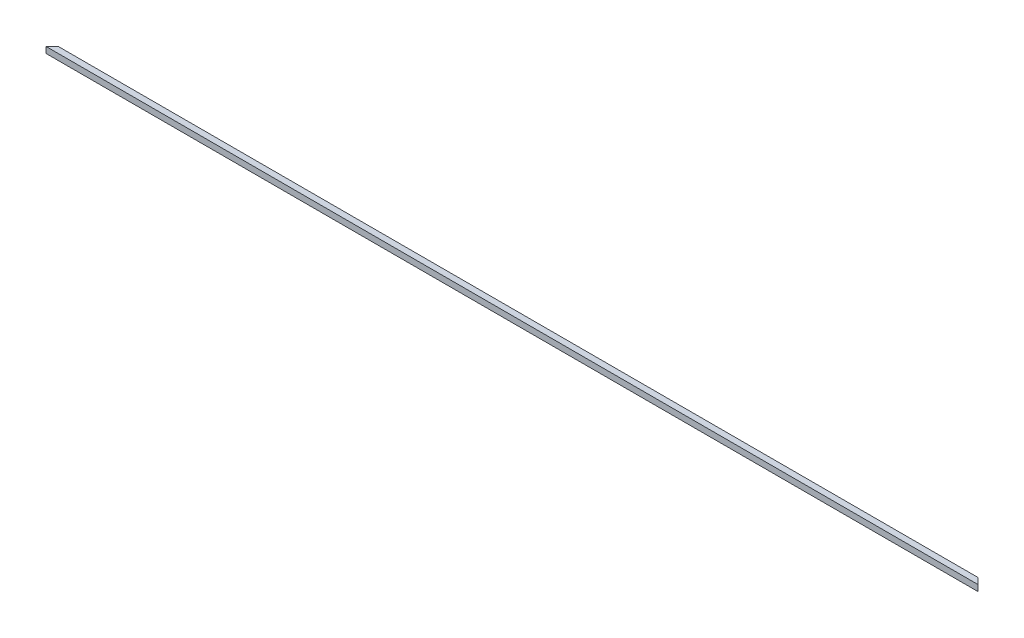
ISO-10303-21;
HEADER;
FILE_DESCRIPTION(('STEP AP214'),'2;1');
FILE_NAME('part.step','',(''),(''),'','','');
FILE_SCHEMA(('AUTOMOTIVE_DESIGN { 1 0 10303 214 1 1 1 1 }'));
ENDSEC;
DATA;
#1=APPLICATION_CONTEXT('core data for automotive mechanical design processes');
#2=APPLICATION_PROTOCOL_DEFINITION('international standard','automotive_design',2000,#1);
#3=PRODUCT_CONTEXT('',#1,'mechanical');
#4=PRODUCT('Part','Part','',(#3));
#5=PRODUCT_RELATED_PRODUCT_CATEGORY('part','',(#4));
#6=PRODUCT_DEFINITION_FORMATION('','',#4);
#7=PRODUCT_DEFINITION_CONTEXT('part definition',#1,'design');
#8=PRODUCT_DEFINITION('design','',#6,#7);
#9=PRODUCT_DEFINITION_SHAPE('','',#8);
#10=(LENGTH_UNIT() NAMED_UNIT(*) SI_UNIT(.MILLI.,.METRE.));
#11=(NAMED_UNIT(*) PLANE_ANGLE_UNIT() SI_UNIT($,.RADIAN.));
#12=(NAMED_UNIT(*) SI_UNIT($,.STERADIAN.) SOLID_ANGLE_UNIT());
#13=UNCERTAINTY_MEASURE_WITH_UNIT(LENGTH_MEASURE(1.E-05),#10,'distance_accuracy_value','');
#14=(GEOMETRIC_REPRESENTATION_CONTEXT(3) GLOBAL_UNCERTAINTY_ASSIGNED_CONTEXT((#13)) GLOBAL_UNIT_ASSIGNED_CONTEXT((#10,
#11,#12)) REPRESENTATION_CONTEXT('',''));
#15=CARTESIAN_POINT('',(0.,0.,0.));
#16=DIRECTION('',(0.,0.,1.));
#17=DIRECTION('',(1.,0.,0.));
#18=AXIS2_PLACEMENT_3D('',#15,#16,#17);
#19=CARTESIAN_POINT('',(19.9999999999998,20.,-19.9999999999996));
#20=DIRECTION('',(0.707106781186544,0.,0.707106781186551));
#21=DIRECTION('',(0.707106781186551,0.,-0.707106781186544));
#22=AXIS2_PLACEMENT_3D('',#19,#20,#21);
#23=PLANE('',#22);
#24=DIRECTION('',(-0.707106781186551,0.,0.707106781186544));
#25=VECTOR('',#24,1.);
#26=CARTESIAN_POINT('',(19.9999999999998,0.,-19.9999999999996));
#27=LINE('',#26,#25);
#28=CARTESIAN_POINT('',(19.9999999999998,0.,-19.9999999999996));
#29=VERTEX_POINT('',#28);
#30=CARTESIAN_POINT('',(0.,0.,0.));
#31=VERTEX_POINT('',#30);
#32=EDGE_CURVE('E96',#29,#31,#27,.T.);
#33=ORIENTED_EDGE('',*,*,#32,.T.);
#34=DIRECTION('',(0.,-1.,0.));
#35=VECTOR('',#34,1.);
#36=CARTESIAN_POINT('',(0.,20.,0.));
#37=LINE('',#36,#35);
#38=CARTESIAN_POINT('',(0.,20.,0.));
#39=VERTEX_POINT('',#38);
#40=EDGE_CURVE('E11',#39,#31,#37,.T.);
#41=ORIENTED_EDGE('',*,*,#40,.F.);
#42=DIRECTION('',(-0.707106781186551,0.,0.707106781186544));
#43=VECTOR('',#42,1.);
#44=CARTESIAN_POINT('',(19.9999999999998,20.,-19.9999999999996));
#45=LINE('',#44,#43);
#46=CARTESIAN_POINT('',(19.9999999999998,20.,-19.9999999999996));
#47=VERTEX_POINT('',#46);
#48=EDGE_CURVE('E84',#47,#39,#45,.T.);
#49=ORIENTED_EDGE('',*,*,#48,.F.);
#50=DIRECTION('',(0.,-1.,0.));
#51=VECTOR('',#50,1.);
#52=CARTESIAN_POINT('',(19.9999999999998,20.,-19.9999999999996));
#53=LINE('',#52,#51);
#54=EDGE_CURVE('E92',#47,#29,#53,.T.);
#55=ORIENTED_EDGE('',*,*,#54,.T.);
#56=EDGE_LOOP('',(#33,#41,#49,#55));
#57=FACE_BOUND('',#56,.T.);
#58=ADVANCED_FACE('F33',(#57),#23,.F.);
#59=CARTESIAN_POINT('',(0.,20.,0.));
#60=DIRECTION('',(0.,0.,-1.));
#61=DIRECTION('',(-1.,0.,0.));
#62=AXIS2_PLACEMENT_3D('',#59,#60,#61);
#63=PLANE('',#62);
#64=DIRECTION('',(1.,0.,0.));
#65=VECTOR('',#64,1.);
#66=CARTESIAN_POINT('',(0.,0.,0.));
#67=LINE('',#66,#65);
#68=CARTESIAN_POINT('',(3048.,0.,0.));
#69=VERTEX_POINT('',#68);
#70=EDGE_CURVE('E88',#31,#69,#67,.T.);
#71=ORIENTED_EDGE('',*,*,#70,.T.);
#72=DIRECTION('',(0.,-1.,0.));
#73=VECTOR('',#72,1.);
#74=CARTESIAN_POINT('',(3048.,20.,0.));
#75=LINE('',#74,#73);
#76=CARTESIAN_POINT('',(3048.,20.,0.));
#77=VERTEX_POINT('',#76);
#78=EDGE_CURVE('E41',#77,#69,#75,.T.);
#79=ORIENTED_EDGE('',*,*,#78,.F.);
#80=DIRECTION('',(1.,0.,0.));
#81=VECTOR('',#80,1.);
#82=CARTESIAN_POINT('',(0.,20.,0.));
#83=LINE('',#82,#81);
#84=EDGE_CURVE('E79',#39,#77,#83,.T.);
#85=ORIENTED_EDGE('',*,*,#84,.F.);
#86=ORIENTED_EDGE('',*,*,#40,.T.);
#87=EDGE_LOOP('',(#71,#79,#85,#86));
#88=FACE_BOUND('',#87,.T.);
#89=ADVANCED_FACE('F87',(#88),#63,.F.);
#90=CARTESIAN_POINT('',(3048.,20.,0.));
#91=DIRECTION('',(-0.707106781186547,0.,0.707106781186548));
#92=DIRECTION('',(0.707106781186548,0.,0.707106781186547));
#93=AXIS2_PLACEMENT_3D('',#90,#91,#92);
#94=PLANE('',#93);
#95=DIRECTION('',(-0.707106781186548,0.,-0.707106781186547));
#96=VECTOR('',#95,1.);
#97=CARTESIAN_POINT('',(3048.,0.,0.));
#98=LINE('',#97,#96);
#99=CARTESIAN_POINT('',(3028.,0.,-20.));
#100=VERTEX_POINT('',#99);
#101=EDGE_CURVE('E66',#69,#100,#98,.T.);
#102=ORIENTED_EDGE('',*,*,#101,.T.);
#103=DIRECTION('',(0.,-1.,0.));
#104=VECTOR('',#103,1.);
#105=CARTESIAN_POINT('',(3028.,20.,-20.));
#106=LINE('',#105,#104);
#107=CARTESIAN_POINT('',(3028.,20.,-20.));
#108=VERTEX_POINT('',#107);
#109=EDGE_CURVE('E89',#108,#100,#106,.T.);
#110=ORIENTED_EDGE('',*,*,#109,.F.);
#111=DIRECTION('',(-0.707106781186548,0.,-0.707106781186547));
#112=VECTOR('',#111,1.);
#113=CARTESIAN_POINT('',(3048.,20.,0.));
#114=LINE('',#113,#112);
#115=EDGE_CURVE('E82',#77,#108,#114,.T.);
#116=ORIENTED_EDGE('',*,*,#115,.F.);
#117=ORIENTED_EDGE('',*,*,#78,.T.);
#118=EDGE_LOOP('',(#102,#110,#116,#117));
#119=FACE_BOUND('',#118,.T.);
#120=ADVANCED_FACE('F90',(#119),#94,.F.);
#121=CARTESIAN_POINT('',(3028.,20.,-20.));
#122=DIRECTION('',(0.,0.,1.));
#123=DIRECTION('',(1.,0.,0.));
#124=AXIS2_PLACEMENT_3D('',#121,#122,#123);
#125=PLANE('',#124);
#126=DIRECTION('',(-1.,0.,0.));
#127=VECTOR('',#126,1.);
#128=CARTESIAN_POINT('',(3028.,0.,-20.));
#129=LINE('',#128,#127);
#130=EDGE_CURVE('E72',#100,#29,#129,.T.);
#131=ORIENTED_EDGE('',*,*,#130,.T.);
#132=ORIENTED_EDGE('',*,*,#54,.F.);
#133=DIRECTION('',(-1.,0.,0.));
#134=VECTOR('',#133,1.);
#135=CARTESIAN_POINT('',(3028.,20.,-20.));
#136=LINE('',#135,#134);
#137=EDGE_CURVE('E49',#108,#47,#136,.T.);
#138=ORIENTED_EDGE('',*,*,#137,.F.);
#139=ORIENTED_EDGE('',*,*,#109,.T.);
#140=EDGE_LOOP('',(#131,#132,#138,#139));
#141=FACE_BOUND('',#140,.T.);
#142=ADVANCED_FACE('F103',(#141),#125,.F.);
#143=CARTESIAN_POINT('',(0.,20.,0.));
#144=DIRECTION('',(0.,-1.,0.));
#145=DIRECTION('',(0.,0.,-1.));
#146=AXIS2_PLACEMENT_3D('',#143,#144,#145);
#147=PLANE('',#146);
#148=ORIENTED_EDGE('',*,*,#48,.T.);
#149=ORIENTED_EDGE('',*,*,#84,.T.);
#150=ORIENTED_EDGE('',*,*,#115,.T.);
#151=ORIENTED_EDGE('',*,*,#137,.T.);
#152=EDGE_LOOP('',(#148,#149,#150,#151));
#153=FACE_BOUND('',#152,.T.);
#154=ADVANCED_FACE('F80',(#153),#147,.F.);
#155=CARTESIAN_POINT('',(0.,0.,0.));
#156=DIRECTION('',(0.,-1.,0.));
#157=DIRECTION('',(0.,0.,-1.));
#158=AXIS2_PLACEMENT_3D('',#155,#156,#157);
#159=PLANE('',#158);
#160=ORIENTED_EDGE('',*,*,#32,.F.);
#161=ORIENTED_EDGE('',*,*,#130,.F.);
#162=ORIENTED_EDGE('',*,*,#101,.F.);
#163=ORIENTED_EDGE('',*,*,#70,.F.);
#164=EDGE_LOOP('',(#160,#161,#162,#163));
#165=FACE_BOUND('',#164,.T.);
#166=ADVANCED_FACE('F106',(#165),#159,.T.);
#167=CLOSED_SHELL('',(#58,#89,#120,#142,#154,#166));
#168=MANIFOLD_SOLID_BREP('B2',#167);
#169=ADVANCED_BREP_SHAPE_REPRESENTATION('',(#18,#168),#14);
#170=SHAPE_DEFINITION_REPRESENTATION(#9,#169);
ENDSEC;
END-ISO-10303-21;
